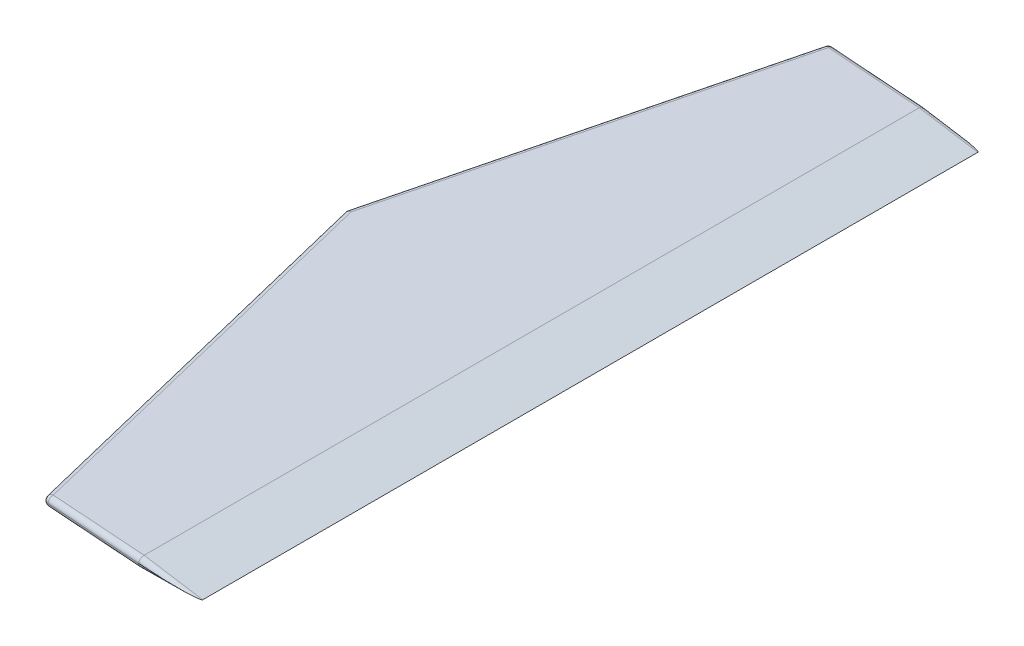
ISO-10303-21;
HEADER;
FILE_DESCRIPTION(('STEP AP214'),'2;1');
FILE_NAME('part.step','',(''),(''),'','','');
FILE_SCHEMA(('AUTOMOTIVE_DESIGN { 1 0 10303 214 1 1 1 1 }'));
ENDSEC;
DATA;
#1=APPLICATION_CONTEXT('core data for automotive mechanical design processes');
#2=APPLICATION_PROTOCOL_DEFINITION('international standard','automotive_design',2000,#1);
#3=PRODUCT_CONTEXT('',#1,'mechanical');
#4=PRODUCT('Part','Part','',(#3));
#5=PRODUCT_RELATED_PRODUCT_CATEGORY('part','',(#4));
#6=PRODUCT_DEFINITION_FORMATION('','',#4);
#7=PRODUCT_DEFINITION_CONTEXT('part definition',#1,'design');
#8=PRODUCT_DEFINITION('design','',#6,#7);
#9=PRODUCT_DEFINITION_SHAPE('','',#8);
#10=(LENGTH_UNIT() NAMED_UNIT(*) SI_UNIT(.MILLI.,.METRE.));
#11=(NAMED_UNIT(*) PLANE_ANGLE_UNIT() SI_UNIT($,.RADIAN.));
#12=(NAMED_UNIT(*) SI_UNIT($,.STERADIAN.) SOLID_ANGLE_UNIT());
#13=UNCERTAINTY_MEASURE_WITH_UNIT(LENGTH_MEASURE(1.E-05),#10,'distance_accuracy_value','');
#14=(GEOMETRIC_REPRESENTATION_CONTEXT(3) GLOBAL_UNCERTAINTY_ASSIGNED_CONTEXT((#13)) GLOBAL_UNIT_ASSIGNED_CONTEXT((#10,
#11,#12)) REPRESENTATION_CONTEXT('',''));
#15=CARTESIAN_POINT('',(0.,0.,0.));
#16=DIRECTION('',(0.,0.,1.));
#17=DIRECTION('',(1.,0.,0.));
#18=AXIS2_PLACEMENT_3D('',#15,#16,#17);
#19=CARTESIAN_POINT('',(0.,0.,280.));
#20=DIRECTION('',(0.073586321084746,0.997288851511543,0.));
#21=DIRECTION('',(-0.997288851511543,0.073586321084746,0.));
#22=AXIS2_PLACEMENT_3D('',#19,#20,#21);
#23=PLANE('',#22);
#24=DIRECTION('',(0.225516635985481,-0.0166400532407709,-0.974097200243352));
#25=VECTOR('',#24,1.);
#26=CARTESIAN_POINT('',(-58.1089376687722,4.28764739393888,266.47375352134));
#27=LINE('',#26,#25);
#28=CARTESIAN_POINT('',(3.58332924005771,-0.264400845965131,-1.03084845465135E-13));
#29=VERTEX_POINT('',#28);
#30=CARTESIAN_POINT('',(67.5968073964549,-4.98772283059227,-276.5));
#31=VERTEX_POINT('',#30);
#32=EDGE_CURVE('E198',#29,#31,#27,.T.);
#33=ORIENTED_EDGE('',*,*,#32,.T.);
#34=DIRECTION('',(0.997288851511543,-0.073586321084746,0.));
#35=VECTOR('',#34,1.);
#36=CARTESIAN_POINT('',(0.,0.,-276.5));
#37=LINE('',#36,#35);
#38=CARTESIAN_POINT('',(132.439959480733,-9.77226344005428,-276.5));
#39=VERTEX_POINT('',#38);
#40=EDGE_CURVE('E11',#31,#39,#37,.T.);
#41=ORIENTED_EDGE('',*,*,#40,.T.);
#42=DIRECTION('',(0.,0.,1.));
#43=VECTOR('',#42,1.);
#44=CARTESIAN_POINT('',(132.439959480733,-9.77226344005428,-280.));
#45=LINE('',#44,#43);
#46=CARTESIAN_POINT('',(132.439959480733,-9.77226344005428,276.5));
#47=VERTEX_POINT('',#46);
#48=EDGE_CURVE('E119',#39,#47,#45,.T.);
#49=ORIENTED_EDGE('',*,*,#48,.T.);
#50=DIRECTION('',(0.997288851511543,-0.073586321084746,0.));
#51=VECTOR('',#50,1.);
#52=CARTESIAN_POINT('',(68.407104588308,-5.04751171647363,276.5));
#53=LINE('',#52,#51);
#54=CARTESIAN_POINT('',(67.5968073964549,-4.98772283059227,276.5));
#55=VERTEX_POINT('',#54);
#56=EDGE_CURVE('E166',#47,#55,#53,.F.);
#57=ORIENTED_EDGE('',*,*,#56,.T.);
#58=DIRECTION('',(-0.225516635985481,0.0166400532407709,-0.974097200243352));
#59=VECTOR('',#58,1.);
#60=CARTESIAN_POINT('',(64.9091316154112,-4.78940899935289,264.890845570945));
#61=LINE('',#60,#59);
#62=EDGE_CURVE('E200',#55,#29,#61,.T.);
#63=ORIENTED_EDGE('',*,*,#62,.T.);
#64=EDGE_LOOP('',(#33,#41,#49,#57,#63));
#65=FACE_BOUND('',#64,.T.);
#66=ADVANCED_FACE('F32',(#65),#23,.F.);
#67=CARTESIAN_POINT('',(175.040653262113,-5.89658422924975,280.));
#68=DIRECTION('',(-0.0735863210847459,-0.997288851511543,0.));
#69=DIRECTION('',(0.997288851511543,-0.0735863210847459,0.));
#70=AXIS2_PLACEMENT_3D('',#67,#68,#69);
#71=PLANE('',#70);
#72=DIRECTION('',(0.,0.,1.));
#73=VECTOR('',#72,1.);
#74=CARTESIAN_POINT('',(132.955063728326,-2.79124147947348,-280.));
#75=LINE('',#74,#73);
#76=CARTESIAN_POINT('',(132.955063728326,-2.79124147947348,-276.5));
#77=VERTEX_POINT('',#76);
#78=CARTESIAN_POINT('',(132.955063728326,-2.79124147947348,276.5));
#79=VERTEX_POINT('',#78);
#80=EDGE_CURVE('E101',#77,#79,#75,.T.);
#81=ORIENTED_EDGE('',*,*,#80,.F.);
#82=DIRECTION('',(-0.997288851511543,0.0735863210847459,0.));
#83=VECTOR('',#82,1.);
#84=CARTESIAN_POINT('',(175.040653262113,-5.89658422924975,-276.5));
#85=LINE('',#84,#83);
#86=CARTESIAN_POINT('',(68.1119116440481,1.99329912998852,-276.5));
#87=VERTEX_POINT('',#86);
#88=EDGE_CURVE('E108',#77,#87,#85,.T.);
#89=ORIENTED_EDGE('',*,*,#88,.T.);
#90=DIRECTION('',(0.225516635985481,-0.0166400532407709,-0.974097200243352));
#91=VECTOR('',#90,1.);
#92=CARTESIAN_POINT('',(-48.6695315199826,10.6101775402741,227.926098453261));
#93=LINE('',#92,#91);
#94=CARTESIAN_POINT('',(4.09843348765094,6.71662111461564,0.));
#95=VERTEX_POINT('',#94);
#96=EDGE_CURVE('E175',#87,#95,#93,.F.);
#97=ORIENTED_EDGE('',*,*,#96,.T.);
#98=DIRECTION('',(-0.225516635985481,0.0166400532407709,-0.974097200243352));
#99=VECTOR('',#98,1.);
#100=CARTESIAN_POINT('',(74.3485377642007,1.53312114698241,303.438500639023));
#101=LINE('',#100,#99);
#102=CARTESIAN_POINT('',(68.1119116440481,1.99329912998852,276.5));
#103=VERTEX_POINT('',#102);
#104=EDGE_CURVE('E196',#95,#103,#101,.F.);
#105=ORIENTED_EDGE('',*,*,#104,.T.);
#106=DIRECTION('',(-0.997288851511543,0.0735863210847459,0.));
#107=VECTOR('',#106,1.);
#108=CARTESIAN_POINT('',(132.955063728326,-2.79124147947348,276.5));
#109=LINE('',#108,#107);
#110=EDGE_CURVE('E118',#103,#79,#109,.F.);
#111=ORIENTED_EDGE('',*,*,#110,.T.);
#112=EDGE_LOOP('',(#81,#89,#97,#105,#111));
#113=FACE_BOUND('',#112,.T.);
#114=ADVANCED_FACE('F113',(#113),#71,.F.);
#115=CARTESIAN_POINT('',(132.955063728326,-2.79124147947348,-280.));
#116=DIRECTION('',(-0.155765033161105,-0.987794135660017,0.));
#117=DIRECTION('',(0.987794135660017,-0.155765033161105,0.));
#118=AXIS2_PLACEMENT_3D('',#115,#116,#117);
#119=PLANE('',#118);
#120=DIRECTION('',(0.,0.,1.));
#121=VECTOR('',#120,1.);
#122=CARTESIAN_POINT('',(174.783101138317,-9.38709520954016,-280.));
#123=LINE('',#122,#121);
#124=CARTESIAN_POINT('',(174.783101138317,-9.38709520954016,-276.5));
#125=VERTEX_POINT('',#124);
#126=CARTESIAN_POINT('',(174.783101138317,-9.38709520954016,276.5));
#127=VERTEX_POINT('',#126);
#128=EDGE_CURVE('E104',#125,#127,#123,.T.);
#129=ORIENTED_EDGE('',*,*,#128,.F.);
#130=DIRECTION('',(0.987794135660017,-0.155765033161105,0.));
#131=VECTOR('',#130,1.);
#132=CARTESIAN_POINT('',(132.955063728326,-2.79124147947348,-276.5));
#133=LINE('',#132,#131);
#134=EDGE_CURVE('E96',#125,#77,#133,.F.);
#135=ORIENTED_EDGE('',*,*,#134,.T.);
#136=ORIENTED_EDGE('',*,*,#80,.T.);
#137=DIRECTION('',(0.987794135660017,-0.155765033161105,0.));
#138=VECTOR('',#137,1.);
#139=CARTESIAN_POINT('',(174.783101138317,-9.38709520954016,276.5));
#140=LINE('',#139,#138);
#141=EDGE_CURVE('E172',#79,#127,#140,.T.);
#142=ORIENTED_EDGE('',*,*,#141,.T.);
#143=EDGE_LOOP('',(#129,#135,#136,#142));
#144=FACE_BOUND('',#143,.T.);
#145=ADVANCED_FACE('F98',(#144),#119,.F.);
#146=CARTESIAN_POINT('',(132.439959480733,-9.77226344005428,-280.));
#147=DIRECTION('',(-0.00909597826967425,0.999958630733951,0.));
#148=DIRECTION('',(-0.999958630733951,-0.00909597826967425,0.));
#149=AXIS2_PLACEMENT_3D('',#146,#147,#148);
#150=PLANE('',#149);
#151=ORIENTED_EDGE('',*,*,#48,.F.);
#152=DIRECTION('',(-0.999958630733951,-0.00909597826967425,0.));
#153=VECTOR('',#152,1.);
#154=CARTESIAN_POINT('',(132.439959480733,-9.77226344005428,-276.5));
#155=LINE('',#154,#153);
#156=EDGE_CURVE('E109',#39,#125,#155,.F.);
#157=ORIENTED_EDGE('',*,*,#156,.T.);
#158=ORIENTED_EDGE('',*,*,#128,.T.);
#159=DIRECTION('',(-0.999958630733951,-0.00909597826967425,0.));
#160=VECTOR('',#159,1.);
#161=CARTESIAN_POINT('',(132.439959480733,-9.77226344005428,276.5));
#162=LINE('',#161,#160);
#163=EDGE_CURVE('E169',#127,#47,#162,.T.);
#164=ORIENTED_EDGE('',*,*,#163,.T.);
#165=EDGE_LOOP('',(#151,#157,#158,#164));
#166=FACE_BOUND('',#165,.T.);
#167=ADVANCED_FACE('F216',(#166),#150,.F.);
#168=CARTESIAN_POINT('',(3.65764909711613,3.23963017758337,-0.791453975197723));
#169=DIRECTION('',(-0.225516635985481,0.0166400532407709,-0.974097200243352));
#170=DIRECTION('',(-0.974232087810949,0.,0.225547864276121));
#171=AXIS2_PLACEMENT_3D('',#168,#169,#170);
#172=CYLINDRICAL_SURFACE('',#171,3.5);
#173=DIRECTION('',(-0.225516635985481,0.0166400532407709,-0.974097200243352));
#174=VECTOR('',#173,1.);
#175=CARTESIAN_POINT('',(0.25755212379657,3.49051098029038,0.));
#176=LINE('',#175,#174);
#177=CARTESIAN_POINT('',(64.4542625469319,-1.24633104759486,277.291453975198));
#178=VERTEX_POINT('',#177);
#179=CARTESIAN_POINT('',(0.440784390534775,3.47699093703228,0.791453975197725));
#180=VERTEX_POINT('',#179);
#181=EDGE_CURVE('E182',#178,#180,#176,.T.);
#182=ORIENTED_EDGE('',*,*,#181,.F.);
#183=CARTESIAN_POINT('',(67.8543595202515,-1.49721185030188,276.5));
#184=DIRECTION('',(-0.225516635985481,0.0166400532407709,-0.974097200243352));
#185=DIRECTION('',(-0.974232087810949,0.,0.225547864276121));
#186=AXIS2_PLACEMENT_3D('',#183,#184,#185);
#187=CIRCLE('',#186,3.5);
#188=EDGE_CURVE('E142',#178,#103,#187,.T.);
#189=ORIENTED_EDGE('',*,*,#188,.T.);
#190=ORIENTED_EDGE('',*,*,#104,.F.);
#191=CARTESIAN_POINT('',(3.84088136385433,3.22611013432525,0.));
#192=DIRECTION('',(-0.225516635985481,0.0166400532407707,-0.974097200243352));
#193=DIRECTION('',(-0.974232087810949,0.,0.225547864276121));
#194=AXIS2_PLACEMENT_3D('',#191,#192,#193);
#195=CIRCLE('',#194,3.5);
#196=EDGE_CURVE('E176',#180,#95,#195,.T.);
#197=ORIENTED_EDGE('',*,*,#196,.F.);
#198=EDGE_LOOP('',(#182,#189,#190,#197));
#199=FACE_BOUND('',#198,.T.);
#200=ADVANCED_FACE('F279',(#199),#172,.T.);
#201=CARTESIAN_POINT('',(3.84088136385433,3.22611013432524,0.));
#202=DIRECTION('',(0.,0.,1.));
#203=DIRECTION('',(1.,0.,0.));
#204=AXIS2_PLACEMENT_3D('',#201,#202,#203);
#205=SPHERICAL_SURFACE('',#204,3.5);
#206=CARTESIAN_POINT('',(3.84088136385433,3.22611013432525,0.));
#207=DIRECTION('',(0.0735863210847458,0.997288851511543,0.));
#208=DIRECTION('',(-0.997288851511543,0.0735863210847458,0.));
#209=AXIS2_PLACEMENT_3D('',#206,#207,#208);
#210=CIRCLE('',#209,3.5);
#211=CARTESIAN_POINT('',(0.440784390534775,3.47699093703228,-0.791453975197721));
#212=VERTEX_POINT('',#211);
#213=EDGE_CURVE('E179',#180,#212,#210,.F.);
#214=ORIENTED_EDGE('',*,*,#213,.F.);
#215=ORIENTED_EDGE('',*,*,#196,.T.);
#216=CARTESIAN_POINT('',(3.84088136385433,3.22611013432524,0.));
#217=DIRECTION('',(-0.225516635985481,0.0166400532407709,0.974097200243352));
#218=DIRECTION('',(0.974232087810949,0.,0.225547864276121));
#219=AXIS2_PLACEMENT_3D('',#216,#217,#218);
#220=CIRCLE('',#219,3.5);
#221=EDGE_CURVE('E185',#212,#95,#220,.F.);
#222=ORIENTED_EDGE('',*,*,#221,.F.);
#223=EDGE_LOOP('',(#214,#215,#222));
#224=FACE_BOUND('',#223,.T.);
#225=ADVANCED_FACE('F283',(#224),#205,.T.);
#226=CARTESIAN_POINT('',(65.1666837392078,-1.29889801906248,264.890845570945));
#227=DIRECTION('',(-0.225516635985481,0.0166400532407709,-0.974097200243352));
#228=DIRECTION('',(-0.974232087810949,0.,0.225547864276121));
#229=AXIS2_PLACEMENT_3D('',#226,#227,#228);
#230=CYLINDRICAL_SURFACE('',#229,3.5);
#231=ORIENTED_EDGE('',*,*,#62,.F.);
#232=CARTESIAN_POINT('',(67.8543595202515,-1.49721185030187,276.5));
#233=DIRECTION('',(-0.225516635985481,0.0166400532407709,-0.974097200243352));
#234=DIRECTION('',(-0.974232087810949,0.,0.225547864276121));
#235=AXIS2_PLACEMENT_3D('',#232,#233,#234);
#236=CIRCLE('',#235,3.5);
#237=EDGE_CURVE('E163',#55,#178,#236,.T.);
#238=ORIENTED_EDGE('',*,*,#237,.T.);
#239=ORIENTED_EDGE('',*,*,#181,.T.);
#240=CARTESIAN_POINT('',(3.84088136385432,3.22611013432527,-1.03084845465135E-13));
#241=DIRECTION('',(-0.22551663598551,0.0166400532407731,-0.974097200243345));
#242=DIRECTION('',(-0.974232087810942,0.,0.22554786427615));
#243=AXIS2_PLACEMENT_3D('',#240,#241,#242);
#244=CIRCLE('',#243,3.5);
#245=EDGE_CURVE('E188',#29,#180,#244,.T.);
#246=ORIENTED_EDGE('',*,*,#245,.F.);
#247=EDGE_LOOP('',(#231,#238,#239,#246));
#248=FACE_BOUND('',#247,.T.);
#249=ADVANCED_FACE('F253',(#248),#230,.T.);
#250=CARTESIAN_POINT('',(3.65764909711613,3.23963017758337,0.791453975197723));
#251=DIRECTION('',(0.225516635985481,-0.0166400532407709,-0.974097200243352));
#252=DIRECTION('',(-0.974232087810949,0.,-0.225547864276121));
#253=AXIS2_PLACEMENT_3D('',#250,#251,#252);
#254=CYLINDRICAL_SURFACE('',#253,3.5);
#255=ORIENTED_EDGE('',*,*,#96,.F.);
#256=CARTESIAN_POINT('',(67.8543595202515,-1.49721185030188,-276.5));
#257=DIRECTION('',(0.225516635985481,-0.0166400532407709,-0.974097200243352));
#258=DIRECTION('',(-0.974232087810949,0.,-0.225547864276121));
#259=AXIS2_PLACEMENT_3D('',#256,#257,#258);
#260=CIRCLE('',#259,3.5);
#261=CARTESIAN_POINT('',(64.4542625469319,-1.24633104759486,-277.291453975198));
#262=VERTEX_POINT('',#261);
#263=EDGE_CURVE('E122',#87,#262,#260,.F.);
#264=ORIENTED_EDGE('',*,*,#263,.T.);
#265=DIRECTION('',(0.225516635985481,-0.0166400532407709,-0.974097200243352));
#266=VECTOR('',#265,1.);
#267=CARTESIAN_POINT('',(0.257552123796571,3.49051098029039,0.));
#268=LINE('',#267,#266);
#269=EDGE_CURVE('E191',#212,#262,#268,.T.);
#270=ORIENTED_EDGE('',*,*,#269,.F.);
#271=ORIENTED_EDGE('',*,*,#221,.T.);
#272=EDGE_LOOP('',(#255,#264,#270,#271));
#273=FACE_BOUND('',#272,.T.);
#274=ADVANCED_FACE('F267',(#273),#254,.T.);
#275=CARTESIAN_POINT('',(3.84088136385433,3.22611013432527,0.));
#276=DIRECTION('',(0.,0.,1.));
#277=DIRECTION('',(1.,0.,0.));
#278=AXIS2_PLACEMENT_3D('',#275,#276,#277);
#279=SPHERICAL_SURFACE('',#278,3.5);
#280=ORIENTED_EDGE('',*,*,#245,.T.);
#281=ORIENTED_EDGE('',*,*,#213,.T.);
#282=CARTESIAN_POINT('',(3.84088136385433,3.22611013432527,0.));
#283=DIRECTION('',(-0.225516635985483,0.0166400532407411,0.974097200243352));
#284=DIRECTION('',(0.974232087810948,0.,0.225547864276123));
#285=AXIS2_PLACEMENT_3D('',#282,#283,#284);
#286=CIRCLE('',#285,3.5);
#287=EDGE_CURVE('E146',#29,#212,#286,.F.);
#288=ORIENTED_EDGE('',*,*,#287,.F.);
#289=EDGE_LOOP('',(#280,#281,#288));
#290=FACE_BOUND('',#289,.T.);
#291=ADVANCED_FACE('F255',(#290),#279,.T.);
#292=CARTESIAN_POINT('',(-57.8513855449755,7.77815837422928,266.47375352134));
#293=DIRECTION('',(0.225516635985481,-0.0166400532407709,-0.974097200243352));
#294=DIRECTION('',(-0.974232087810949,0.,-0.225547864276121));
#295=AXIS2_PLACEMENT_3D('',#292,#293,#294);
#296=CYLINDRICAL_SURFACE('',#295,3.5);
#297=ORIENTED_EDGE('',*,*,#269,.T.);
#298=CARTESIAN_POINT('',(67.8543595202515,-1.49721185030186,-276.5));
#299=DIRECTION('',(0.225516635985481,-0.0166400532407709,-0.974097200243352));
#300=DIRECTION('',(-0.974232087810949,0.,-0.225547864276121));
#301=AXIS2_PLACEMENT_3D('',#298,#299,#300);
#302=CIRCLE('',#301,3.5);
#303=EDGE_CURVE('E42',#262,#31,#302,.F.);
#304=ORIENTED_EDGE('',*,*,#303,.T.);
#305=ORIENTED_EDGE('',*,*,#32,.F.);
#306=ORIENTED_EDGE('',*,*,#287,.T.);
#307=EDGE_LOOP('',(#297,#304,#305,#306));
#308=FACE_BOUND('',#307,.T.);
#309=ADVANCED_FACE('F258',(#308),#296,.T.);
#310=CARTESIAN_POINT('',(132.408123556789,-6.27240823248545,276.5));
#311=DIRECTION('',(0.999958630733951,0.00909597826967425,0.));
#312=DIRECTION('',(-0.00909597826967425,0.999958630733951,0.));
#313=AXIS2_PLACEMENT_3D('',#310,#311,#312);
#314=CYLINDRICAL_SURFACE('',#313,3.5);
#315=CARTESIAN_POINT('',(132.553010997396,-6.27109028495146,276.5));
#316=DIRECTION('',(-0.999479097825775,0.0322727905421188,0.));
#317=DIRECTION('',(0.0322727905421189,0.999479097825775,0.));
#318=AXIS2_PLACEMENT_3D('',#315,#316,#317);
#319=ELLIPSE('',#318,3.50299787431173,3.5);
#320=CARTESIAN_POINT('',(132.5530109974,-6.27109028495158,280.));
#321=VERTEX_POINT('',#320);
#322=EDGE_CURVE('E147',#47,#321,#319,.T.);
#323=ORIENTED_EDGE('',*,*,#322,.F.);
#324=ORIENTED_EDGE('',*,*,#163,.F.);
#325=CARTESIAN_POINT('',(132.5530109974,-6.27109028495158,276.5));
#326=DIRECTION('',(0.0735863210847458,0.997288851511543,0.));
#327=DIRECTION('',(0.997288851511543,-0.0735863210847459,0.));
#328=AXIS2_PLACEMENT_3D('',#325,#326,#327);
#329=ELLIPSE('',#328,42.3448934347462,3.5);
#330=EDGE_CURVE('E143',#321,#127,#329,.T.);
#331=ORIENTED_EDGE('',*,*,#330,.F.);
#332=EDGE_LOOP('',(#323,#324,#331));
#333=FACE_BOUND('',#332,.T.);
#334=ADVANCED_FACE('F218',(#333),#314,.T.);
#335=CARTESIAN_POINT('',(67.8543595202515,-1.49721185030187,276.5));
#336=DIRECTION('',(0.,0.,1.));
#337=DIRECTION('',(1.,0.,0.));
#338=AXIS2_PLACEMENT_3D('',#335,#336,#337);
#339=SPHERICAL_SURFACE('',#338,3.5);
#340=CARTESIAN_POINT('',(67.8543595202515,-1.49721185030187,276.5));
#341=DIRECTION('',(0.0735863210847431,0.997288851511543,0.));
#342=DIRECTION('',(-0.997288851511543,0.0735863210847431,0.));
#343=AXIS2_PLACEMENT_3D('',#340,#341,#342);
#344=CIRCLE('',#343,3.5);
#345=CARTESIAN_POINT('',(67.8543595202515,-1.49721185030188,280.));
#346=VERTEX_POINT('',#345);
#347=EDGE_CURVE('E151',#178,#346,#344,.T.);
#348=ORIENTED_EDGE('',*,*,#347,.F.);
#349=ORIENTED_EDGE('',*,*,#237,.F.);
#350=CARTESIAN_POINT('',(67.8543595202515,-1.49721185030187,276.5));
#351=DIRECTION('',(0.997288851511543,-0.0735863210847446,0.));
#352=DIRECTION('',(0.0735863210847446,0.997288851511543,0.));
#353=AXIS2_PLACEMENT_3D('',#350,#351,#352);
#354=CIRCLE('',#353,3.5);
#355=EDGE_CURVE('E78',#346,#55,#354,.T.);
#356=ORIENTED_EDGE('',*,*,#355,.F.);
#357=EDGE_LOOP('',(#348,#349,#356));
#358=FACE_BOUND('',#357,.T.);
#359=ADVANCED_FACE('F265',(#358),#339,.T.);
#360=CARTESIAN_POINT('',(132.409886112262,-6.24852095428354,276.5));
#361=DIRECTION('',(-0.987794135660017,0.155765033161105,0.));
#362=DIRECTION('',(-0.155765033161105,-0.987794135660017,0.));
#363=AXIS2_PLACEMENT_3D('',#360,#361,#362);
#364=CYLINDRICAL_SURFACE('',#363,3.5);
#365=ORIENTED_EDGE('',*,*,#330,.T.);
#366=ORIENTED_EDGE('',*,*,#141,.F.);
#367=CARTESIAN_POINT('',(132.553010997408,-6.27109028495246,276.5));
#368=DIRECTION('',(-0.993391640627765,0.11477390091339,0.));
#369=DIRECTION('',(0.114773900913391,0.993391640627765,0.));
#370=AXIS2_PLACEMENT_3D('',#367,#368,#369);
#371=ELLIPSE('',#370,3.50299787431173,3.5);
#372=EDGE_CURVE('E153',#321,#79,#371,.T.);
#373=ORIENTED_EDGE('',*,*,#372,.F.);
#374=EDGE_LOOP('',(#365,#366,#373));
#375=FACE_BOUND('',#374,.T.);
#376=ADVANCED_FACE('F298',(#375),#364,.T.);
#377=CARTESIAN_POINT('',(0.257552123796611,3.4905109802904,276.5));
#378=DIRECTION('',(-0.997288851511543,0.073586321084746,0.));
#379=DIRECTION('',(-0.073586321084746,-0.997288851511543,0.));
#380=AXIS2_PLACEMENT_3D('',#377,#378,#379);
#381=CYLINDRICAL_SURFACE('',#380,3.5);
#382=ORIENTED_EDGE('',*,*,#56,.F.);
#383=ORIENTED_EDGE('',*,*,#322,.T.);
#384=DIRECTION('',(0.997288851511543,-0.073586321084746,0.));
#385=VECTOR('',#384,1.);
#386=CARTESIAN_POINT('',(132.69751160453,-6.28175245976387,280.));
#387=LINE('',#386,#385);
#388=EDGE_CURVE('E155',#346,#321,#387,.T.);
#389=ORIENTED_EDGE('',*,*,#388,.F.);
#390=ORIENTED_EDGE('',*,*,#355,.T.);
#391=EDGE_LOOP('',(#382,#383,#389,#390));
#392=FACE_BOUND('',#391,.T.);
#393=ADVANCED_FACE('F222',(#392),#381,.T.);
#394=CARTESIAN_POINT('',(67.8543595202515,-1.49721185030188,276.5));
#395=DIRECTION('',(0.,0.,1.));
#396=DIRECTION('',(1.,0.,0.));
#397=AXIS2_PLACEMENT_3D('',#394,#395,#396);
#398=SPHERICAL_SURFACE('',#397,3.5);
#399=ORIENTED_EDGE('',*,*,#188,.F.);
#400=ORIENTED_EDGE('',*,*,#347,.T.);
#401=CARTESIAN_POINT('',(67.8543595202515,-1.49721185030188,276.5));
#402=DIRECTION('',(0.997288851511544,-0.0735863210847406,0.));
#403=DIRECTION('',(0.0735863210847406,0.997288851511544,0.));
#404=AXIS2_PLACEMENT_3D('',#401,#402,#403);
#405=CIRCLE('',#404,3.5);
#406=EDGE_CURVE('E158',#103,#346,#405,.T.);
#407=ORIENTED_EDGE('',*,*,#406,.F.);
#408=EDGE_LOOP('',(#399,#400,#407));
#409=FACE_BOUND('',#408,.T.);
#410=ADVANCED_FACE('F229',(#409),#398,.T.);
#411=CARTESIAN_POINT('',(0.257552123796609,3.49051098029038,276.5));
#412=DIRECTION('',(0.997288851511543,-0.0735863210847459,0.));
#413=DIRECTION('',(0.0735863210847459,0.997288851511543,0.));
#414=AXIS2_PLACEMENT_3D('',#411,#412,#413);
#415=CYLINDRICAL_SURFACE('',#414,3.5);
#416=ORIENTED_EDGE('',*,*,#372,.T.);
#417=ORIENTED_EDGE('',*,*,#110,.F.);
#418=ORIENTED_EDGE('',*,*,#406,.T.);
#419=ORIENTED_EDGE('',*,*,#388,.T.);
#420=EDGE_LOOP('',(#416,#417,#418,#419));
#421=FACE_BOUND('',#420,.T.);
#422=ADVANCED_FACE('F225',(#421),#415,.T.);
#423=CARTESIAN_POINT('',(67.8543595202515,-1.49721185030188,-276.5));
#424=DIRECTION('',(0.,0.,1.));
#425=DIRECTION('',(1.,0.,0.));
#426=AXIS2_PLACEMENT_3D('',#423,#424,#425);
#427=SPHERICAL_SURFACE('',#426,3.5);
#428=CARTESIAN_POINT('',(67.8543595202515,-1.49721185030188,-276.5));
#429=DIRECTION('',(-0.0735863210847483,-0.997288851511543,0.));
#430=DIRECTION('',(0.997288851511543,-0.0735863210847483,0.));
#431=AXIS2_PLACEMENT_3D('',#428,#429,#430);
#432=CIRCLE('',#431,3.5);
#433=CARTESIAN_POINT('',(67.8543595202514,-1.49721185030186,-280.));
#434=VERTEX_POINT('',#433);
#435=EDGE_CURVE('E127',#262,#434,#432,.T.);
#436=ORIENTED_EDGE('',*,*,#435,.F.);
#437=ORIENTED_EDGE('',*,*,#263,.F.);
#438=CARTESIAN_POINT('',(67.8543595202515,-1.49721185030188,-276.5));
#439=DIRECTION('',(0.997288851511544,-0.0735863210847327,0.));
#440=DIRECTION('',(0.0735863210847327,0.997288851511544,0.));
#441=AXIS2_PLACEMENT_3D('',#438,#439,#440);
#442=CIRCLE('',#441,3.5);
#443=EDGE_CURVE('E36',#434,#87,#442,.T.);
#444=ORIENTED_EDGE('',*,*,#443,.F.);
#445=EDGE_LOOP('',(#436,#437,#444));
#446=FACE_BOUND('',#445,.T.);
#447=ADVANCED_FACE('F34',(#446),#427,.T.);
#448=CARTESIAN_POINT('',(174.783101138317,-9.38709520954015,-276.5));
#449=DIRECTION('',(-0.997288851511543,0.0735863210847459,0.));
#450=DIRECTION('',(-0.0735863210847459,-0.997288851511543,0.));
#451=AXIS2_PLACEMENT_3D('',#448,#449,#450);
#452=CYLINDRICAL_SURFACE('',#451,3.5);
#453=ORIENTED_EDGE('',*,*,#443,.T.);
#454=ORIENTED_EDGE('',*,*,#88,.F.);
#455=CARTESIAN_POINT('',(132.553010997397,-6.2710902849512,-276.5));
#456=DIRECTION('',(-0.993391640627765,0.11477390091339,0.));
#457=DIRECTION('',(-0.114773900913391,-0.993391640627765,0.));
#458=AXIS2_PLACEMENT_3D('',#455,#456,#457);
#459=ELLIPSE('',#458,3.50299787431173,3.5);
#460=CARTESIAN_POINT('',(132.5530109974,-6.27109028495158,-280.));
#461=VERTEX_POINT('',#460);
#462=EDGE_CURVE('E62',#461,#77,#459,.F.);
#463=ORIENTED_EDGE('',*,*,#462,.F.);
#464=DIRECTION('',(-0.997288851511543,0.0735863210847459,0.));
#465=VECTOR('',#464,1.);
#466=CARTESIAN_POINT('',(0.257552123796609,3.49051098029037,-280.));
#467=LINE('',#466,#465);
#468=EDGE_CURVE('E128',#434,#461,#467,.F.);
#469=ORIENTED_EDGE('',*,*,#468,.F.);
#470=EDGE_LOOP('',(#453,#454,#463,#469));
#471=FACE_BOUND('',#470,.T.);
#472=ADVANCED_FACE('F121',(#471),#452,.T.);
#473=CARTESIAN_POINT('',(67.8543595202514,-1.49721185030186,-276.5));
#474=DIRECTION('',(0.,0.,1.));
#475=DIRECTION('',(1.,0.,0.));
#476=AXIS2_PLACEMENT_3D('',#473,#474,#475);
#477=SPHERICAL_SURFACE('',#476,3.5);
#478=ORIENTED_EDGE('',*,*,#303,.F.);
#479=ORIENTED_EDGE('',*,*,#435,.T.);
#480=CARTESIAN_POINT('',(67.8543595202514,-1.49721185030186,-276.5));
#481=DIRECTION('',(0.997288851511543,-0.0735863210847446,0.));
#482=DIRECTION('',(0.0735863210847446,0.997288851511543,0.));
#483=AXIS2_PLACEMENT_3D('',#480,#481,#482);
#484=CIRCLE('',#483,3.5);
#485=EDGE_CURVE('E130',#31,#434,#484,.T.);
#486=ORIENTED_EDGE('',*,*,#485,.F.);
#487=EDGE_LOOP('',(#478,#479,#486));
#488=FACE_BOUND('',#487,.T.);
#489=ADVANCED_FACE('F314',(#488),#477,.T.);
#490=CARTESIAN_POINT('',(2.25120628301352,14.2761717401734,-276.5));
#491=DIRECTION('',(0.987794135660017,-0.155765033161105,0.));
#492=DIRECTION('',(0.155765033161105,0.987794135660017,0.));
#493=AXIS2_PLACEMENT_3D('',#490,#491,#492);
#494=CYLINDRICAL_SURFACE('',#493,3.5);
#495=ORIENTED_EDGE('',*,*,#462,.T.);
#496=ORIENTED_EDGE('',*,*,#134,.F.);
#497=CARTESIAN_POINT('',(132.5530109974,-6.27109028495159,-276.5));
#498=DIRECTION('',(-0.0735863210847458,-0.997288851511543,0.));
#499=DIRECTION('',(0.997288851511543,-0.0735863210847459,0.));
#500=AXIS2_PLACEMENT_3D('',#497,#498,#499);
#501=ELLIPSE('',#500,42.3448934347462,3.5);
#502=EDGE_CURVE('E125',#461,#125,#501,.T.);
#503=ORIENTED_EDGE('',*,*,#502,.F.);
#504=EDGE_LOOP('',(#495,#496,#503));
#505=FACE_BOUND('',#504,.T.);
#506=ADVANCED_FACE('F124',(#505),#494,.T.);
#507=CARTESIAN_POINT('',(0.257552123796611,3.4905109802904,-276.5));
#508=DIRECTION('',(0.997288851511543,-0.073586321084746,0.));
#509=DIRECTION('',(0.073586321084746,0.997288851511543,0.));
#510=AXIS2_PLACEMENT_3D('',#507,#508,#509);
#511=CYLINDRICAL_SURFACE('',#510,3.5);
#512=ORIENTED_EDGE('',*,*,#485,.T.);
#513=ORIENTED_EDGE('',*,*,#468,.T.);
#514=CARTESIAN_POINT('',(132.5530109974,-6.27109028495158,-276.5));
#515=DIRECTION('',(0.999479097825775,-0.0322727905421188,0.));
#516=DIRECTION('',(-0.0322727905421189,-0.999479097825775,0.));
#517=AXIS2_PLACEMENT_3D('',#514,#515,#516);
#518=ELLIPSE('',#517,3.50299787431173,3.5);
#519=EDGE_CURVE('E136',#39,#461,#518,.T.);
#520=ORIENTED_EDGE('',*,*,#519,.F.);
#521=ORIENTED_EDGE('',*,*,#40,.F.);
#522=EDGE_LOOP('',(#512,#513,#520,#521));
#523=FACE_BOUND('',#522,.T.);
#524=ADVANCED_FACE('F307',(#523),#511,.T.);
#525=CARTESIAN_POINT('',(0.0680063558875842,-7.476220863596,-276.5));
#526=DIRECTION('',(-0.999958630733951,-0.00909597826967425,0.));
#527=DIRECTION('',(0.00909597826967425,-0.999958630733951,0.));
#528=AXIS2_PLACEMENT_3D('',#525,#526,#527);
#529=CYLINDRICAL_SURFACE('',#528,3.5);
#530=ORIENTED_EDGE('',*,*,#502,.T.);
#531=ORIENTED_EDGE('',*,*,#156,.F.);
#532=ORIENTED_EDGE('',*,*,#519,.T.);
#533=EDGE_LOOP('',(#530,#531,#532));
#534=FACE_BOUND('',#533,.T.);
#535=ADVANCED_FACE('F304',(#534),#529,.T.);
#536=CLOSED_SHELL('',(#66,#114,#145,#167,#200,#225,#249,#274,#291,#309,#334,#359,#376,#393,#410,
#422,#447,#472,#489,#506,#524,#535));
#537=MANIFOLD_SOLID_BREP('B2',#536);
#538=ADVANCED_BREP_SHAPE_REPRESENTATION('',(#18,#537),#14);
#539=SHAPE_DEFINITION_REPRESENTATION(#9,#538);
ENDSEC;
END-ISO-10303-21;
